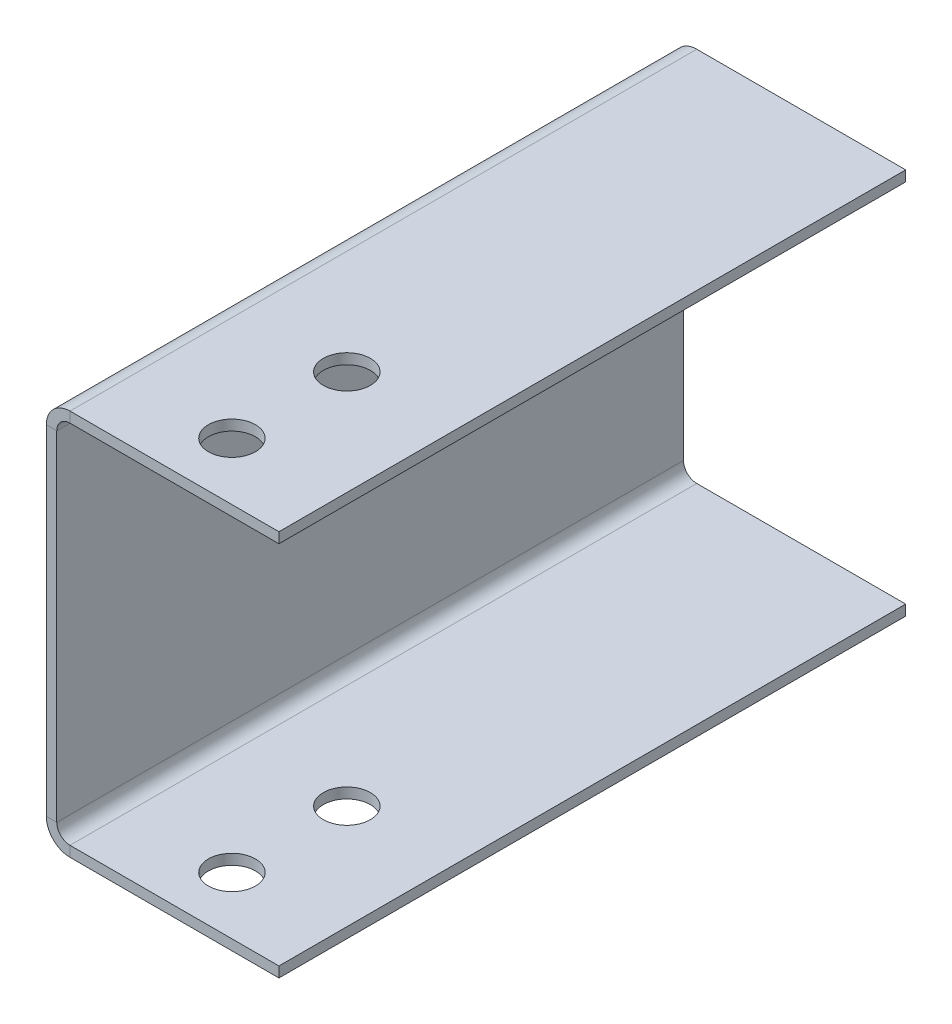
ISO-10303-21;
HEADER;
FILE_DESCRIPTION(('STEP AP214'),'2;1');
FILE_NAME('part.step','',(''),(''),'','','');
FILE_SCHEMA(('AUTOMOTIVE_DESIGN { 1 0 10303 214 1 1 1 1 }'));
ENDSEC;
DATA;
#1=APPLICATION_CONTEXT('core data for automotive mechanical design processes');
#2=APPLICATION_PROTOCOL_DEFINITION('international standard','automotive_design',2000,#1);
#3=PRODUCT_CONTEXT('',#1,'mechanical');
#4=PRODUCT('Part','Part','',(#3));
#5=PRODUCT_RELATED_PRODUCT_CATEGORY('part','',(#4));
#6=PRODUCT_DEFINITION_FORMATION('','',#4);
#7=PRODUCT_DEFINITION_CONTEXT('part definition',#1,'design');
#8=PRODUCT_DEFINITION('design','',#6,#7);
#9=PRODUCT_DEFINITION_SHAPE('','',#8);
#10=(LENGTH_UNIT() NAMED_UNIT(*) SI_UNIT(.MILLI.,.METRE.));
#11=(NAMED_UNIT(*) PLANE_ANGLE_UNIT() SI_UNIT($,.RADIAN.));
#12=(NAMED_UNIT(*) SI_UNIT($,.STERADIAN.) SOLID_ANGLE_UNIT());
#13=UNCERTAINTY_MEASURE_WITH_UNIT(LENGTH_MEASURE(1.E-05),#10,'distance_accuracy_value','');
#14=(GEOMETRIC_REPRESENTATION_CONTEXT(3) GLOBAL_UNCERTAINTY_ASSIGNED_CONTEXT((#13)) GLOBAL_UNIT_ASSIGNED_CONTEXT((#10,
#11,#12)) REPRESENTATION_CONTEXT('',''));
#15=CARTESIAN_POINT('',(0.,0.,0.));
#16=DIRECTION('',(0.,0.,1.));
#17=DIRECTION('',(1.,0.,0.));
#18=AXIS2_PLACEMENT_3D('',#15,#16,#17);
#19=CARTESIAN_POINT('',(-10.135,18.5,0.));
#20=DIRECTION('',(0.,0.,1.));
#21=DIRECTION('',(0.,-1.,0.));
#22=AXIS2_PLACEMENT_3D('',#19,#20,#21);
#23=PLANE('',#22);
#24=DIRECTION('',(1.,0.,0.));
#25=VECTOR('',#24,1.);
#26=CARTESIAN_POINT('',(-10.135,-16.23,0.));
#27=LINE('',#26,#25);
#28=CARTESIAN_POINT('',(-11.135,-16.23,0.));
#29=VERTEX_POINT('',#28);
#30=CARTESIAN_POINT('',(-10.135,-16.23,0.));
#31=VERTEX_POINT('',#30);
#32=EDGE_CURVE('E11',#29,#31,#27,.T.);
#33=ORIENTED_EDGE('',*,*,#32,.F.);
#34=DIRECTION('',(0.,1.,0.));
#35=VECTOR('',#34,1.);
#36=CARTESIAN_POINT('',(-11.135,18.5,0.));
#37=LINE('',#36,#35);
#38=CARTESIAN_POINT('',(-11.135,16.23,0.));
#39=VERTEX_POINT('',#38);
#40=EDGE_CURVE('E98',#39,#29,#37,.F.);
#41=ORIENTED_EDGE('',*,*,#40,.F.);
#42=DIRECTION('',(1.,0.,0.));
#43=VECTOR('',#42,1.);
#44=CARTESIAN_POINT('',(-10.135,16.23,0.));
#45=LINE('',#44,#43);
#46=CARTESIAN_POINT('',(-10.135,16.23,0.));
#47=VERTEX_POINT('',#46);
#48=EDGE_CURVE('E51',#39,#47,#45,.T.);
#49=ORIENTED_EDGE('',*,*,#48,.T.);
#50=DIRECTION('',(0.,-1.,0.));
#51=VECTOR('',#50,1.);
#52=CARTESIAN_POINT('',(-10.135,18.5,0.));
#53=LINE('',#52,#51);
#54=EDGE_CURVE('E100',#47,#31,#53,.T.);
#55=ORIENTED_EDGE('',*,*,#54,.T.);
#56=EDGE_LOOP('',(#33,#41,#49,#55));
#57=FACE_BOUND('',#56,.T.);
#58=ADVANCED_FACE('F41',(#57),#23,.F.);
#59=CARTESIAN_POINT('',(-8.865,16.23,0.));
#60=DIRECTION('',(0.,0.,-1.));
#61=DIRECTION('',(-1.,0.,0.));
#62=AXIS2_PLACEMENT_3D('',#59,#60,#61);
#63=PLANE('',#62);
#64=ORIENTED_EDGE('',*,*,#48,.F.);
#65=CARTESIAN_POINT('',(-8.865,16.23,0.));
#66=DIRECTION('',(0.,0.,1.));
#67=DIRECTION('',(1.,0.,0.));
#68=AXIS2_PLACEMENT_3D('',#65,#66,#67);
#69=CIRCLE('',#68,2.27);
#70=CARTESIAN_POINT('',(-8.865,18.5,0.));
#71=VERTEX_POINT('',#70);
#72=EDGE_CURVE('E139',#39,#71,#69,.F.);
#73=ORIENTED_EDGE('',*,*,#72,.T.);
#74=DIRECTION('',(0.,-1.,0.));
#75=VECTOR('',#74,1.);
#76=CARTESIAN_POINT('',(-8.865,17.5,0.));
#77=LINE('',#76,#75);
#78=CARTESIAN_POINT('',(-8.865,17.5,0.));
#79=VERTEX_POINT('',#78);
#80=EDGE_CURVE('E166',#71,#79,#77,.T.);
#81=ORIENTED_EDGE('',*,*,#80,.T.);
#82=CARTESIAN_POINT('',(-8.865,16.23,0.));
#83=DIRECTION('',(0.,0.,1.));
#84=DIRECTION('',(1.,0.,0.));
#85=AXIS2_PLACEMENT_3D('',#82,#83,#84);
#86=CIRCLE('',#85,1.27);
#87=EDGE_CURVE('E175',#47,#79,#86,.F.);
#88=ORIENTED_EDGE('',*,*,#87,.F.);
#89=EDGE_LOOP('',(#64,#73,#81,#88));
#90=FACE_BOUND('',#89,.T.);
#91=ADVANCED_FACE('F174',(#90),#63,.T.);
#92=CARTESIAN_POINT('',(-11.135,17.5,0.));
#93=DIRECTION('',(0.,0.,1.));
#94=DIRECTION('',(-1.,0.,0.));
#95=AXIS2_PLACEMENT_3D('',#92,#93,#94);
#96=PLANE('',#95);
#97=ORIENTED_EDGE('',*,*,#80,.F.);
#98=DIRECTION('',(1.,0.,0.));
#99=VECTOR('',#98,1.);
#100=CARTESIAN_POINT('',(-11.135,18.5,0.));
#101=LINE('',#100,#99);
#102=CARTESIAN_POINT('',(11.135,18.5,0.));
#103=VERTEX_POINT('',#102);
#104=EDGE_CURVE('E136',#103,#71,#101,.F.);
#105=ORIENTED_EDGE('',*,*,#104,.F.);
#106=DIRECTION('',(0.,-1.,0.));
#107=VECTOR('',#106,1.);
#108=CARTESIAN_POINT('',(11.135,17.5,0.));
#109=LINE('',#108,#107);
#110=CARTESIAN_POINT('',(11.135,17.5,0.));
#111=VERTEX_POINT('',#110);
#112=EDGE_CURVE('E163',#103,#111,#109,.T.);
#113=ORIENTED_EDGE('',*,*,#112,.T.);
#114=DIRECTION('',(-1.,0.,0.));
#115=VECTOR('',#114,1.);
#116=CARTESIAN_POINT('',(-11.135,17.5,0.));
#117=LINE('',#116,#115);
#118=EDGE_CURVE('E194',#111,#79,#117,.T.);
#119=ORIENTED_EDGE('',*,*,#118,.T.);
#120=EDGE_LOOP('',(#97,#105,#113,#119));
#121=FACE_BOUND('',#120,.T.);
#122=ADVANCED_FACE('F195',(#121),#96,.F.);
#123=CARTESIAN_POINT('',(11.135,17.5,60.));
#124=DIRECTION('',(-1.,0.,0.));
#125=DIRECTION('',(0.,0.,-1.));
#126=AXIS2_PLACEMENT_3D('',#123,#124,#125);
#127=PLANE('',#126);
#128=ORIENTED_EDGE('',*,*,#112,.F.);
#129=DIRECTION('',(0.,0.,-1.));
#130=VECTOR('',#129,1.);
#131=CARTESIAN_POINT('',(11.135,18.5,60.));
#132=LINE('',#131,#130);
#133=CARTESIAN_POINT('',(11.135,18.5,60.));
#134=VERTEX_POINT('',#133);
#135=EDGE_CURVE('E233',#134,#103,#132,.T.);
#136=ORIENTED_EDGE('',*,*,#135,.F.);
#137=DIRECTION('',(0.,-1.,0.));
#138=VECTOR('',#137,1.);
#139=CARTESIAN_POINT('',(11.135,17.5,60.));
#140=LINE('',#139,#138);
#141=CARTESIAN_POINT('',(11.135,17.5,60.));
#142=VERTEX_POINT('',#141);
#143=EDGE_CURVE('E160',#134,#142,#140,.T.);
#144=ORIENTED_EDGE('',*,*,#143,.T.);
#145=DIRECTION('',(0.,0.,-1.));
#146=VECTOR('',#145,1.);
#147=CARTESIAN_POINT('',(11.135,17.5,60.));
#148=LINE('',#147,#146);
#149=EDGE_CURVE('E199',#142,#111,#148,.T.);
#150=ORIENTED_EDGE('',*,*,#149,.T.);
#151=EDGE_LOOP('',(#128,#136,#144,#150));
#152=FACE_BOUND('',#151,.T.);
#153=ADVANCED_FACE('F327',(#152),#127,.F.);
#154=CARTESIAN_POINT('',(-11.135,17.5,60.));
#155=DIRECTION('',(0.,0.,1.));
#156=DIRECTION('',(-1.,0.,0.));
#157=AXIS2_PLACEMENT_3D('',#154,#155,#156);
#158=PLANE('',#157);
#159=ORIENTED_EDGE('',*,*,#143,.F.);
#160=DIRECTION('',(1.,0.,0.));
#161=VECTOR('',#160,1.);
#162=CARTESIAN_POINT('',(-11.135,18.5,60.));
#163=LINE('',#162,#161);
#164=CARTESIAN_POINT('',(-8.865,18.5,60.));
#165=VERTEX_POINT('',#164);
#166=EDGE_CURVE('E129',#134,#165,#163,.F.);
#167=ORIENTED_EDGE('',*,*,#166,.T.);
#168=DIRECTION('',(0.,-1.,0.));
#169=VECTOR('',#168,1.);
#170=CARTESIAN_POINT('',(-8.865,17.5,60.));
#171=LINE('',#170,#169);
#172=CARTESIAN_POINT('',(-8.865,17.5,60.));
#173=VERTEX_POINT('',#172);
#174=EDGE_CURVE('E157',#165,#173,#171,.T.);
#175=ORIENTED_EDGE('',*,*,#174,.T.);
#176=DIRECTION('',(-1.,0.,0.));
#177=VECTOR('',#176,1.);
#178=CARTESIAN_POINT('',(-11.135,17.5,60.));
#179=LINE('',#178,#177);
#180=EDGE_CURVE('E205',#142,#173,#179,.T.);
#181=ORIENTED_EDGE('',*,*,#180,.F.);
#182=EDGE_LOOP('',(#159,#167,#175,#181));
#183=FACE_BOUND('',#182,.T.);
#184=ADVANCED_FACE('F293',(#183),#158,.T.);
#185=CARTESIAN_POINT('',(-8.865,16.23,60.));
#186=DIRECTION('',(0.,0.,1.));
#187=DIRECTION('',(1.,0.,0.));
#188=AXIS2_PLACEMENT_3D('',#185,#186,#187);
#189=PLANE('',#188);
#190=ORIENTED_EDGE('',*,*,#174,.F.);
#191=CARTESIAN_POINT('',(-8.865,16.23,60.));
#192=DIRECTION('',(0.,0.,1.));
#193=DIRECTION('',(1.,0.,0.));
#194=AXIS2_PLACEMENT_3D('',#191,#192,#193);
#195=CIRCLE('',#194,2.27);
#196=CARTESIAN_POINT('',(-11.135,16.23,60.));
#197=VERTEX_POINT('',#196);
#198=EDGE_CURVE('E134',#165,#197,#195,.T.);
#199=ORIENTED_EDGE('',*,*,#198,.T.);
#200=DIRECTION('',(1.,0.,0.));
#201=VECTOR('',#200,1.);
#202=CARTESIAN_POINT('',(-10.135,16.23,60.));
#203=LINE('',#202,#201);
#204=CARTESIAN_POINT('',(-10.135,16.23,60.));
#205=VERTEX_POINT('',#204);
#206=EDGE_CURVE('E155',#197,#205,#203,.T.);
#207=ORIENTED_EDGE('',*,*,#206,.T.);
#208=CARTESIAN_POINT('',(-8.865,16.23,60.));
#209=DIRECTION('',(0.,0.,-1.));
#210=DIRECTION('',(-1.,0.,0.));
#211=AXIS2_PLACEMENT_3D('',#208,#209,#210);
#212=CIRCLE('',#211,1.27);
#213=EDGE_CURVE('E191',#173,#205,#212,.F.);
#214=ORIENTED_EDGE('',*,*,#213,.F.);
#215=EDGE_LOOP('',(#190,#199,#207,#214));
#216=FACE_BOUND('',#215,.T.);
#217=ADVANCED_FACE('F297',(#216),#189,.T.);
#218=CARTESIAN_POINT('',(-10.135,18.5,60.));
#219=DIRECTION('',(0.,0.,1.));
#220=DIRECTION('',(0.,-1.,0.));
#221=AXIS2_PLACEMENT_3D('',#218,#219,#220);
#222=PLANE('',#221);
#223=ORIENTED_EDGE('',*,*,#206,.F.);
#224=DIRECTION('',(0.,1.,0.));
#225=VECTOR('',#224,1.);
#226=CARTESIAN_POINT('',(-11.135,18.5,60.));
#227=LINE('',#226,#225);
#228=CARTESIAN_POINT('',(-11.135,-16.23,60.));
#229=VERTEX_POINT('',#228);
#230=EDGE_CURVE('E128',#197,#229,#227,.F.);
#231=ORIENTED_EDGE('',*,*,#230,.T.);
#232=DIRECTION('',(1.,0.,0.));
#233=VECTOR('',#232,1.);
#234=CARTESIAN_POINT('',(-10.135,-16.23,60.));
#235=LINE('',#234,#233);
#236=CARTESIAN_POINT('',(-10.135,-16.23,60.));
#237=VERTEX_POINT('',#236);
#238=EDGE_CURVE('E152',#229,#237,#235,.T.);
#239=ORIENTED_EDGE('',*,*,#238,.T.);
#240=DIRECTION('',(0.,-1.,0.));
#241=VECTOR('',#240,1.);
#242=CARTESIAN_POINT('',(-10.135,18.5,60.));
#243=LINE('',#242,#241);
#244=EDGE_CURVE('E251',#205,#237,#243,.T.);
#245=ORIENTED_EDGE('',*,*,#244,.F.);
#246=EDGE_LOOP('',(#223,#231,#239,#245));
#247=FACE_BOUND('',#246,.T.);
#248=ADVANCED_FACE('F305',(#247),#222,.T.);
#249=CARTESIAN_POINT('',(-8.865,-16.23,60.));
#250=DIRECTION('',(0.,0.,1.));
#251=DIRECTION('',(1.,0.,0.));
#252=AXIS2_PLACEMENT_3D('',#249,#250,#251);
#253=PLANE('',#252);
#254=ORIENTED_EDGE('',*,*,#238,.F.);
#255=CARTESIAN_POINT('',(-8.865,-16.23,60.));
#256=DIRECTION('',(0.,0.,1.));
#257=DIRECTION('',(1.,0.,0.));
#258=AXIS2_PLACEMENT_3D('',#255,#256,#257);
#259=CIRCLE('',#258,2.27);
#260=CARTESIAN_POINT('',(-8.865,-18.5,60.));
#261=VERTEX_POINT('',#260);
#262=EDGE_CURVE('E116',#229,#261,#259,.T.);
#263=ORIENTED_EDGE('',*,*,#262,.T.);
#264=DIRECTION('',(0.,1.,0.));
#265=VECTOR('',#264,1.);
#266=CARTESIAN_POINT('',(-8.865,-17.5,60.));
#267=LINE('',#266,#265);
#268=CARTESIAN_POINT('',(-8.865,-17.5,60.));
#269=VERTEX_POINT('',#268);
#270=EDGE_CURVE('E149',#261,#269,#267,.T.);
#271=ORIENTED_EDGE('',*,*,#270,.T.);
#272=CARTESIAN_POINT('',(-8.865,-16.23,60.));
#273=DIRECTION('',(0.,0.,-1.));
#274=DIRECTION('',(-1.,0.,0.));
#275=AXIS2_PLACEMENT_3D('',#272,#273,#274);
#276=CIRCLE('',#275,1.27);
#277=EDGE_CURVE('E200',#237,#269,#276,.F.);
#278=ORIENTED_EDGE('',*,*,#277,.F.);
#279=EDGE_LOOP('',(#254,#263,#271,#278));
#280=FACE_BOUND('',#279,.T.);
#281=ADVANCED_FACE('F337',(#280),#253,.T.);
#282=CARTESIAN_POINT('',(-11.135,-17.5,60.));
#283=DIRECTION('',(0.,0.,1.));
#284=DIRECTION('',(1.,0.,0.));
#285=AXIS2_PLACEMENT_3D('',#282,#283,#284);
#286=PLANE('',#285);
#287=ORIENTED_EDGE('',*,*,#270,.F.);
#288=DIRECTION('',(1.,0.,0.));
#289=VECTOR('',#288,1.);
#290=CARTESIAN_POINT('',(-11.135,-18.5,60.));
#291=LINE('',#290,#289);
#292=CARTESIAN_POINT('',(11.135,-18.5,60.));
#293=VERTEX_POINT('',#292);
#294=EDGE_CURVE('E225',#261,#293,#291,.T.);
#295=ORIENTED_EDGE('',*,*,#294,.T.);
#296=DIRECTION('',(0.,1.,0.));
#297=VECTOR('',#296,1.);
#298=CARTESIAN_POINT('',(11.135,-17.5,60.));
#299=LINE('',#298,#297);
#300=CARTESIAN_POINT('',(11.135,-17.5,60.));
#301=VERTEX_POINT('',#300);
#302=EDGE_CURVE('E146',#293,#301,#299,.T.);
#303=ORIENTED_EDGE('',*,*,#302,.T.);
#304=DIRECTION('',(1.,0.,0.));
#305=VECTOR('',#304,1.);
#306=CARTESIAN_POINT('',(-11.135,-17.5,60.));
#307=LINE('',#306,#305);
#308=EDGE_CURVE('E257',#269,#301,#307,.T.);
#309=ORIENTED_EDGE('',*,*,#308,.F.);
#310=EDGE_LOOP('',(#287,#295,#303,#309));
#311=FACE_BOUND('',#310,.T.);
#312=ADVANCED_FACE('F275',(#311),#286,.T.);
#313=CARTESIAN_POINT('',(11.135,-17.5,60.));
#314=DIRECTION('',(1.,0.,0.));
#315=DIRECTION('',(0.,0.,-1.));
#316=AXIS2_PLACEMENT_3D('',#313,#314,#315);
#317=PLANE('',#316);
#318=ORIENTED_EDGE('',*,*,#302,.F.);
#319=DIRECTION('',(0.,0.,1.));
#320=VECTOR('',#319,1.);
#321=CARTESIAN_POINT('',(11.135,-18.5,60.));
#322=LINE('',#321,#320);
#323=CARTESIAN_POINT('',(11.135,-18.5,0.));
#324=VERTEX_POINT('',#323);
#325=EDGE_CURVE('E121',#293,#324,#322,.F.);
#326=ORIENTED_EDGE('',*,*,#325,.T.);
#327=DIRECTION('',(0.,1.,0.));
#328=VECTOR('',#327,1.);
#329=CARTESIAN_POINT('',(11.135,-17.5,0.));
#330=LINE('',#329,#328);
#331=CARTESIAN_POINT('',(11.135,-17.5,0.));
#332=VERTEX_POINT('',#331);
#333=EDGE_CURVE('E143',#324,#332,#330,.T.);
#334=ORIENTED_EDGE('',*,*,#333,.T.);
#335=DIRECTION('',(0.,0.,-1.));
#336=VECTOR('',#335,1.);
#337=CARTESIAN_POINT('',(11.135,-17.5,60.));
#338=LINE('',#337,#336);
#339=EDGE_CURVE('E260',#301,#332,#338,.T.);
#340=ORIENTED_EDGE('',*,*,#339,.F.);
#341=EDGE_LOOP('',(#318,#326,#334,#340));
#342=FACE_BOUND('',#341,.T.);
#343=ADVANCED_FACE('F342',(#342),#317,.T.);
#344=CARTESIAN_POINT('',(-11.135,-17.5,0.));
#345=DIRECTION('',(0.,0.,1.));
#346=DIRECTION('',(1.,0.,0.));
#347=AXIS2_PLACEMENT_3D('',#344,#345,#346);
#348=PLANE('',#347);
#349=ORIENTED_EDGE('',*,*,#333,.F.);
#350=DIRECTION('',(1.,0.,0.));
#351=VECTOR('',#350,1.);
#352=CARTESIAN_POINT('',(-11.135,-18.5,0.));
#353=LINE('',#352,#351);
#354=CARTESIAN_POINT('',(-8.865,-18.5,0.));
#355=VERTEX_POINT('',#354);
#356=EDGE_CURVE('E222',#355,#324,#353,.T.);
#357=ORIENTED_EDGE('',*,*,#356,.F.);
#358=DIRECTION('',(0.,1.,0.));
#359=VECTOR('',#358,1.);
#360=CARTESIAN_POINT('',(-8.865,-17.5,0.));
#361=LINE('',#360,#359);
#362=CARTESIAN_POINT('',(-8.865,-17.5,0.));
#363=VERTEX_POINT('',#362);
#364=EDGE_CURVE('E45',#355,#363,#361,.T.);
#365=ORIENTED_EDGE('',*,*,#364,.T.);
#366=DIRECTION('',(1.,0.,0.));
#367=VECTOR('',#366,1.);
#368=CARTESIAN_POINT('',(-11.135,-17.5,0.));
#369=LINE('',#368,#367);
#370=EDGE_CURVE('E254',#363,#332,#369,.T.);
#371=ORIENTED_EDGE('',*,*,#370,.T.);
#372=EDGE_LOOP('',(#349,#357,#365,#371));
#373=FACE_BOUND('',#372,.T.);
#374=ADVANCED_FACE('F284',(#373),#348,.F.);
#375=CARTESIAN_POINT('',(-8.865,-16.23,0.));
#376=DIRECTION('',(0.,0.,-1.));
#377=DIRECTION('',(-1.,0.,0.));
#378=AXIS2_PLACEMENT_3D('',#375,#376,#377);
#379=PLANE('',#378);
#380=CARTESIAN_POINT('',(-8.865,-16.23,0.));
#381=DIRECTION('',(0.,0.,1.));
#382=DIRECTION('',(1.,0.,0.));
#383=AXIS2_PLACEMENT_3D('',#380,#381,#382);
#384=CIRCLE('',#383,2.27);
#385=EDGE_CURVE('E113',#355,#29,#384,.F.);
#386=ORIENTED_EDGE('',*,*,#385,.T.);
#387=ORIENTED_EDGE('',*,*,#32,.T.);
#388=CARTESIAN_POINT('',(-8.865,-16.23,0.));
#389=DIRECTION('',(0.,0.,1.));
#390=DIRECTION('',(1.,0.,0.));
#391=AXIS2_PLACEMENT_3D('',#388,#389,#390);
#392=CIRCLE('',#391,1.27);
#393=EDGE_CURVE('E217',#363,#31,#392,.F.);
#394=ORIENTED_EDGE('',*,*,#393,.F.);
#395=ORIENTED_EDGE('',*,*,#364,.F.);
#396=EDGE_LOOP('',(#386,#387,#394,#395));
#397=FACE_BOUND('',#396,.T.);
#398=ADVANCED_FACE('F43',(#397),#379,.T.);
#399=CARTESIAN_POINT('',(-11.135,-17.5,60.));
#400=DIRECTION('',(0.,1.,0.));
#401=DIRECTION('',(0.,0.,1.));
#402=AXIS2_PLACEMENT_3D('',#399,#400,#401);
#403=PLANE('',#402);
#404=CARTESIAN_POINT('',(1.135,-17.5,54.5));
#405=DIRECTION('',(0.,1.,0.));
#406=DIRECTION('',(0.,0.,1.));
#407=AXIS2_PLACEMENT_3D('',#404,#405,#406);
#408=CIRCLE('',#407,2.25);
#409=CARTESIAN_POINT('',(1.135,-17.5,56.75));
#410=VERTEX_POINT('',#409);
#411=EDGE_CURVE('E237',#410,#410,#408,.T.);
#412=ORIENTED_EDGE('',*,*,#411,.F.);
#413=EDGE_LOOP('',(#412));
#414=FACE_BOUND('',#413,.T.);
#415=CARTESIAN_POINT('',(1.135,-17.5,43.5));
#416=DIRECTION('',(0.,1.,0.));
#417=DIRECTION('',(0.,0.,1.));
#418=AXIS2_PLACEMENT_3D('',#415,#416,#417);
#419=CIRCLE('',#418,2.25);
#420=CARTESIAN_POINT('',(1.135,-17.5,45.75));
#421=VERTEX_POINT('',#420);
#422=EDGE_CURVE('E244',#421,#421,#419,.T.);
#423=ORIENTED_EDGE('',*,*,#422,.F.);
#424=EDGE_LOOP('',(#423));
#425=FACE_BOUND('',#424,.T.);
#426=ORIENTED_EDGE('',*,*,#370,.F.);
#427=DIRECTION('',(0.,0.,-1.));
#428=VECTOR('',#427,1.);
#429=CARTESIAN_POINT('',(-8.865,-17.5,60.));
#430=LINE('',#429,#428);
#431=EDGE_CURVE('E207',#363,#269,#430,.F.);
#432=ORIENTED_EDGE('',*,*,#431,.T.);
#433=ORIENTED_EDGE('',*,*,#308,.T.);
#434=ORIENTED_EDGE('',*,*,#339,.T.);
#435=EDGE_LOOP('',(#426,#432,#433,#434));
#436=FACE_BOUND('',#435,.T.);
#437=ADVANCED_FACE('F280',(#414,#425,#436),#403,.T.);
#438=CARTESIAN_POINT('',(-10.135,18.5,60.));
#439=DIRECTION('',(1.,0.,0.));
#440=DIRECTION('',(0.,1.,0.));
#441=AXIS2_PLACEMENT_3D('',#438,#439,#440);
#442=PLANE('',#441);
#443=ORIENTED_EDGE('',*,*,#54,.F.);
#444=DIRECTION('',(0.,0.,-1.));
#445=VECTOR('',#444,1.);
#446=CARTESIAN_POINT('',(-10.135,16.23,60.));
#447=LINE('',#446,#445);
#448=EDGE_CURVE('E190',#47,#205,#447,.F.);
#449=ORIENTED_EDGE('',*,*,#448,.T.);
#450=ORIENTED_EDGE('',*,*,#244,.T.);
#451=DIRECTION('',(0.,0.,-1.));
#452=VECTOR('',#451,1.);
#453=CARTESIAN_POINT('',(-10.135,-16.23,0.));
#454=LINE('',#453,#452);
#455=EDGE_CURVE('E211',#237,#31,#454,.T.);
#456=ORIENTED_EDGE('',*,*,#455,.T.);
#457=EDGE_LOOP('',(#443,#449,#450,#456));
#458=FACE_BOUND('',#457,.T.);
#459=ADVANCED_FACE('F308',(#458),#442,.T.);
#460=CARTESIAN_POINT('',(-11.135,17.5,60.));
#461=DIRECTION('',(0.,-1.,0.));
#462=DIRECTION('',(0.,0.,-1.));
#463=AXIS2_PLACEMENT_3D('',#460,#461,#462);
#464=PLANE('',#463);
#465=CARTESIAN_POINT('',(1.135,17.5,54.5));
#466=DIRECTION('',(0.,-1.,0.));
#467=DIRECTION('',(0.,0.,-1.));
#468=AXIS2_PLACEMENT_3D('',#465,#466,#467);
#469=CIRCLE('',#468,2.25);
#470=CARTESIAN_POINT('',(1.135,17.5,52.25));
#471=VERTEX_POINT('',#470);
#472=EDGE_CURVE('E239',#471,#471,#469,.T.);
#473=ORIENTED_EDGE('',*,*,#472,.F.);
#474=EDGE_LOOP('',(#473));
#475=FACE_BOUND('',#474,.T.);
#476=CARTESIAN_POINT('',(1.135,17.5,43.5));
#477=DIRECTION('',(0.,-1.,0.));
#478=DIRECTION('',(0.,0.,-1.));
#479=AXIS2_PLACEMENT_3D('',#476,#477,#478);
#480=CIRCLE('',#479,2.25);
#481=CARTESIAN_POINT('',(1.135,17.5,41.25));
#482=VERTEX_POINT('',#481);
#483=EDGE_CURVE('E661',#482,#482,#480,.T.);
#484=ORIENTED_EDGE('',*,*,#483,.F.);
#485=EDGE_LOOP('',(#484));
#486=FACE_BOUND('',#485,.T.);
#487=ORIENTED_EDGE('',*,*,#180,.T.);
#488=DIRECTION('',(0.,0.,-1.));
#489=VECTOR('',#488,1.);
#490=CARTESIAN_POINT('',(-8.865,17.5,0.));
#491=LINE('',#490,#489);
#492=EDGE_CURVE('E188',#173,#79,#491,.T.);
#493=ORIENTED_EDGE('',*,*,#492,.T.);
#494=ORIENTED_EDGE('',*,*,#118,.F.);
#495=ORIENTED_EDGE('',*,*,#149,.F.);
#496=EDGE_LOOP('',(#487,#493,#494,#495));
#497=FACE_BOUND('',#496,.T.);
#498=ADVANCED_FACE('F203',(#475,#486,#497),#464,.T.);
#499=CARTESIAN_POINT('',(-8.865,-16.23,60.));
#500=DIRECTION('',(0.,0.,1.));
#501=DIRECTION('',(1.,0.,0.));
#502=AXIS2_PLACEMENT_3D('',#499,#500,#501);
#503=CYLINDRICAL_SURFACE('',#502,1.27);
#504=ORIENTED_EDGE('',*,*,#277,.T.);
#505=ORIENTED_EDGE('',*,*,#431,.F.);
#506=ORIENTED_EDGE('',*,*,#393,.T.);
#507=ORIENTED_EDGE('',*,*,#455,.F.);
#508=EDGE_LOOP('',(#504,#505,#506,#507));
#509=FACE_BOUND('',#508,.T.);
#510=ADVANCED_FACE('F269',(#509),#503,.F.);
#511=CARTESIAN_POINT('',(-8.865,16.23,60.));
#512=DIRECTION('',(0.,0.,1.));
#513=DIRECTION('',(1.,0.,0.));
#514=AXIS2_PLACEMENT_3D('',#511,#512,#513);
#515=CYLINDRICAL_SURFACE('',#514,1.27);
#516=ORIENTED_EDGE('',*,*,#213,.T.);
#517=ORIENTED_EDGE('',*,*,#448,.F.);
#518=ORIENTED_EDGE('',*,*,#87,.T.);
#519=ORIENTED_EDGE('',*,*,#492,.F.);
#520=EDGE_LOOP('',(#516,#517,#518,#519));
#521=FACE_BOUND('',#520,.T.);
#522=ADVANCED_FACE('F186',(#521),#515,.F.);
#523=CARTESIAN_POINT('',(-11.135,-18.5,60.));
#524=DIRECTION('',(0.,1.,0.));
#525=DIRECTION('',(0.,0.,1.));
#526=AXIS2_PLACEMENT_3D('',#523,#524,#525);
#527=PLANE('',#526);
#528=CARTESIAN_POINT('',(1.135,-18.5,54.5));
#529=DIRECTION('',(0.,1.,0.));
#530=DIRECTION('',(0.,0.,1.));
#531=AXIS2_PLACEMENT_3D('',#528,#529,#530);
#532=CIRCLE('',#531,2.25);
#533=CARTESIAN_POINT('',(1.135,-18.5,56.75));
#534=VERTEX_POINT('',#533);
#535=EDGE_CURVE('E660',#534,#534,#532,.T.);
#536=ORIENTED_EDGE('',*,*,#535,.T.);
#537=EDGE_LOOP('',(#536));
#538=FACE_BOUND('',#537,.T.);
#539=CARTESIAN_POINT('',(1.135,-18.5,43.5));
#540=DIRECTION('',(0.,1.,0.));
#541=DIRECTION('',(0.,0.,1.));
#542=AXIS2_PLACEMENT_3D('',#539,#540,#541);
#543=CIRCLE('',#542,2.25);
#544=CARTESIAN_POINT('',(1.135,-18.5,45.75));
#545=VERTEX_POINT('',#544);
#546=EDGE_CURVE('E672',#545,#545,#543,.T.);
#547=ORIENTED_EDGE('',*,*,#546,.T.);
#548=EDGE_LOOP('',(#547));
#549=FACE_BOUND('',#548,.T.);
#550=ORIENTED_EDGE('',*,*,#356,.T.);
#551=ORIENTED_EDGE('',*,*,#325,.F.);
#552=ORIENTED_EDGE('',*,*,#294,.F.);
#553=DIRECTION('',(0.,0.,1.));
#554=VECTOR('',#553,1.);
#555=CARTESIAN_POINT('',(-8.865,-18.5,60.));
#556=LINE('',#555,#554);
#557=EDGE_CURVE('E120',#355,#261,#556,.T.);
#558=ORIENTED_EDGE('',*,*,#557,.F.);
#559=EDGE_LOOP('',(#550,#551,#552,#558));
#560=FACE_BOUND('',#559,.T.);
#561=ADVANCED_FACE('F357',(#538,#549,#560),#527,.F.);
#562=CARTESIAN_POINT('',(-11.135,18.5,60.));
#563=DIRECTION('',(1.,0.,0.));
#564=DIRECTION('',(0.,1.,0.));
#565=AXIS2_PLACEMENT_3D('',#562,#563,#564);
#566=PLANE('',#565);
#567=ORIENTED_EDGE('',*,*,#40,.T.);
#568=DIRECTION('',(0.,0.,1.));
#569=VECTOR('',#568,1.);
#570=CARTESIAN_POINT('',(-11.135,-16.23,60.));
#571=LINE('',#570,#569);
#572=EDGE_CURVE('E110',#229,#29,#571,.F.);
#573=ORIENTED_EDGE('',*,*,#572,.F.);
#574=ORIENTED_EDGE('',*,*,#230,.F.);
#575=DIRECTION('',(0.,0.,1.));
#576=VECTOR('',#575,1.);
#577=CARTESIAN_POINT('',(-11.135,16.23,60.));
#578=LINE('',#577,#576);
#579=EDGE_CURVE('E126',#39,#197,#578,.T.);
#580=ORIENTED_EDGE('',*,*,#579,.F.);
#581=EDGE_LOOP('',(#567,#573,#574,#580));
#582=FACE_BOUND('',#581,.T.);
#583=ADVANCED_FACE('F124',(#582),#566,.F.);
#584=CARTESIAN_POINT('',(-11.135,18.5,60.));
#585=DIRECTION('',(0.,-1.,0.));
#586=DIRECTION('',(0.,0.,-1.));
#587=AXIS2_PLACEMENT_3D('',#584,#585,#586);
#588=PLANE('',#587);
#589=CARTESIAN_POINT('',(1.135,18.5,54.5));
#590=DIRECTION('',(0.,1.,0.));
#591=DIRECTION('',(0.,0.,1.));
#592=AXIS2_PLACEMENT_3D('',#589,#590,#591);
#593=CIRCLE('',#592,2.25);
#594=CARTESIAN_POINT('',(1.135,18.5,56.75));
#595=VERTEX_POINT('',#594);
#596=EDGE_CURVE('E662',#595,#595,#593,.T.);
#597=ORIENTED_EDGE('',*,*,#596,.F.);
#598=EDGE_LOOP('',(#597));
#599=FACE_BOUND('',#598,.T.);
#600=CARTESIAN_POINT('',(1.135,18.5,43.5));
#601=DIRECTION('',(0.,1.,0.));
#602=DIRECTION('',(0.,0.,1.));
#603=AXIS2_PLACEMENT_3D('',#600,#601,#602);
#604=CIRCLE('',#603,2.25);
#605=CARTESIAN_POINT('',(1.135,18.5,45.75));
#606=VERTEX_POINT('',#605);
#607=EDGE_CURVE('E667',#606,#606,#604,.T.);
#608=ORIENTED_EDGE('',*,*,#607,.F.);
#609=EDGE_LOOP('',(#608));
#610=FACE_BOUND('',#609,.T.);
#611=ORIENTED_EDGE('',*,*,#166,.F.);
#612=ORIENTED_EDGE('',*,*,#135,.T.);
#613=ORIENTED_EDGE('',*,*,#104,.T.);
#614=DIRECTION('',(0.,0.,-1.));
#615=VECTOR('',#614,1.);
#616=CARTESIAN_POINT('',(-8.865,18.5,60.));
#617=LINE('',#616,#615);
#618=EDGE_CURVE('E218',#165,#71,#617,.T.);
#619=ORIENTED_EDGE('',*,*,#618,.F.);
#620=EDGE_LOOP('',(#611,#612,#613,#619));
#621=FACE_BOUND('',#620,.T.);
#622=ADVANCED_FACE('F300',(#599,#610,#621),#588,.F.);
#623=CARTESIAN_POINT('',(-8.865,-16.23,60.));
#624=DIRECTION('',(0.,0.,1.));
#625=DIRECTION('',(1.,0.,0.));
#626=AXIS2_PLACEMENT_3D('',#623,#624,#625);
#627=CYLINDRICAL_SURFACE('',#626,2.27);
#628=ORIENTED_EDGE('',*,*,#262,.F.);
#629=ORIENTED_EDGE('',*,*,#572,.T.);
#630=ORIENTED_EDGE('',*,*,#385,.F.);
#631=ORIENTED_EDGE('',*,*,#557,.T.);
#632=EDGE_LOOP('',(#628,#629,#630,#631));
#633=FACE_BOUND('',#632,.T.);
#634=ADVANCED_FACE('F111',(#633),#627,.T.);
#635=CARTESIAN_POINT('',(-8.865,16.23,60.));
#636=DIRECTION('',(0.,0.,1.));
#637=DIRECTION('',(1.,0.,0.));
#638=AXIS2_PLACEMENT_3D('',#635,#636,#637);
#639=CYLINDRICAL_SURFACE('',#638,2.27);
#640=ORIENTED_EDGE('',*,*,#198,.F.);
#641=ORIENTED_EDGE('',*,*,#618,.T.);
#642=ORIENTED_EDGE('',*,*,#72,.F.);
#643=ORIENTED_EDGE('',*,*,#579,.T.);
#644=EDGE_LOOP('',(#640,#641,#642,#643));
#645=FACE_BOUND('',#644,.T.);
#646=ADVANCED_FACE('F303',(#645),#639,.T.);
#647=CARTESIAN_POINT('',(1.135,-18.5,43.5));
#648=DIRECTION('',(0.,1.,0.));
#649=DIRECTION('',(0.,0.,1.));
#650=AXIS2_PLACEMENT_3D('',#647,#648,#649);
#651=CYLINDRICAL_SURFACE('',#650,2.25);
#652=ORIENTED_EDGE('',*,*,#483,.T.);
#653=EDGE_LOOP('',(#652));
#654=FACE_BOUND('',#653,.T.);
#655=ORIENTED_EDGE('',*,*,#607,.T.);
#656=EDGE_LOOP('',(#655));
#657=FACE_BOUND('',#656,.T.);
#658=ADVANCED_FACE('F349',(#654,#657),#651,.F.);
#659=CARTESIAN_POINT('',(1.135,-18.5,54.5));
#660=DIRECTION('',(0.,1.,0.));
#661=DIRECTION('',(0.,0.,1.));
#662=AXIS2_PLACEMENT_3D('',#659,#660,#661);
#663=CYLINDRICAL_SURFACE('',#662,2.25);
#664=ORIENTED_EDGE('',*,*,#472,.T.);
#665=EDGE_LOOP('',(#664));
#666=FACE_BOUND('',#665,.T.);
#667=ORIENTED_EDGE('',*,*,#596,.T.);
#668=EDGE_LOOP('',(#667));
#669=FACE_BOUND('',#668,.T.);
#670=ADVANCED_FACE('F399',(#666,#669),#663,.F.);
#671=ORIENTED_EDGE('',*,*,#422,.T.);
#672=EDGE_LOOP('',(#671));
#673=FACE_BOUND('',#672,.T.);
#674=ORIENTED_EDGE('',*,*,#546,.F.);
#675=EDGE_LOOP('',(#674));
#676=FACE_BOUND('',#675,.T.);
#677=ADVANCED_FACE('F402',(#673,#676),#651,.F.);
#678=ORIENTED_EDGE('',*,*,#411,.T.);
#679=EDGE_LOOP('',(#678));
#680=FACE_BOUND('',#679,.T.);
#681=ORIENTED_EDGE('',*,*,#535,.F.);
#682=EDGE_LOOP('',(#681));
#683=FACE_BOUND('',#682,.T.);
#684=ADVANCED_FACE('F410',(#680,#683),#663,.F.);
#685=CLOSED_SHELL('',(#58,#91,#122,#153,#184,#217,#248,#281,#312,#343,#374,#398,#437,#459,#498,
#510,#522,#561,#583,#622,#634,#646,#658,#670,#677,#684));
#686=MANIFOLD_SOLID_BREP('B2',#685);
#687=ADVANCED_BREP_SHAPE_REPRESENTATION('',(#18,#686),#14);
#688=SHAPE_DEFINITION_REPRESENTATION(#9,#687);
ENDSEC;
END-ISO-10303-21;
